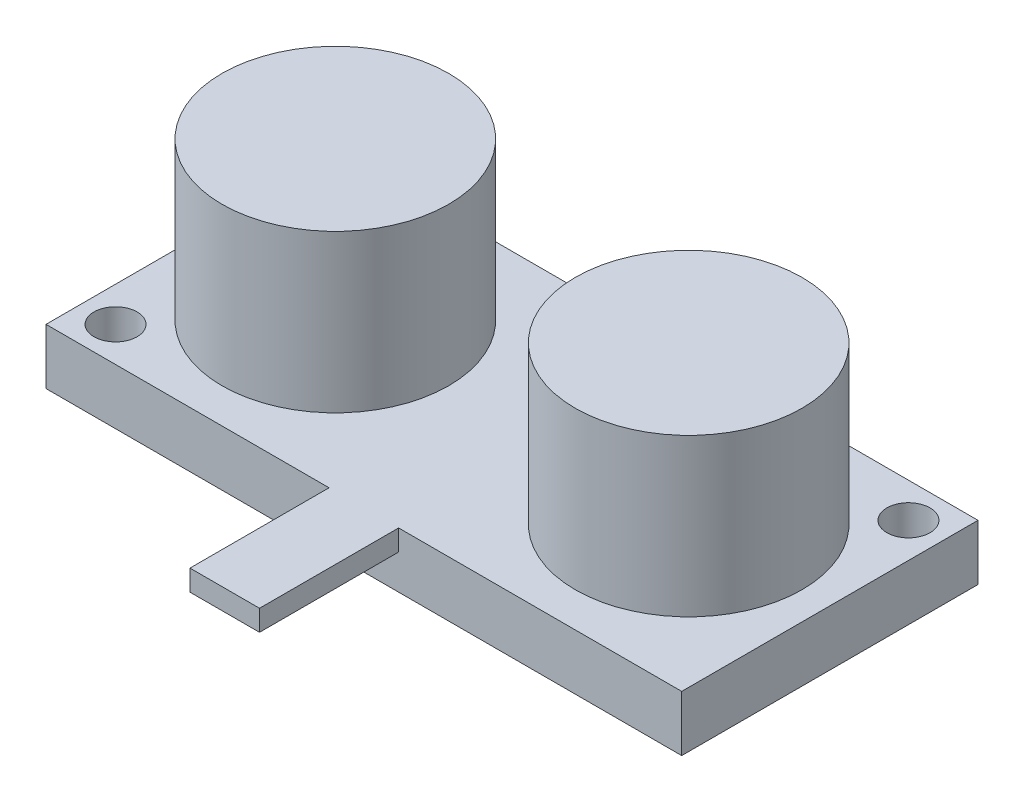
ISO-10303-21;
HEADER;
FILE_DESCRIPTION(('STEP AP214'),'2;1');
FILE_NAME('part.step','',(''),(''),'','','');
FILE_SCHEMA(('AUTOMOTIVE_DESIGN { 1 0 10303 214 1 1 1 1 }'));
ENDSEC;
DATA;
#1=APPLICATION_CONTEXT('core data for automotive mechanical design processes');
#2=APPLICATION_PROTOCOL_DEFINITION('international standard','automotive_design',2000,#1);
#3=PRODUCT_CONTEXT('',#1,'mechanical');
#4=PRODUCT('Part','Part','',(#3));
#5=PRODUCT_RELATED_PRODUCT_CATEGORY('part','',(#4));
#6=PRODUCT_DEFINITION_FORMATION('','',#4);
#7=PRODUCT_DEFINITION_CONTEXT('part definition',#1,'design');
#8=PRODUCT_DEFINITION('design','',#6,#7);
#9=PRODUCT_DEFINITION_SHAPE('','',#8);
#10=(LENGTH_UNIT() NAMED_UNIT(*) SI_UNIT(.MILLI.,.METRE.));
#11=(NAMED_UNIT(*) PLANE_ANGLE_UNIT() SI_UNIT($,.RADIAN.));
#12=(NAMED_UNIT(*) SI_UNIT($,.STERADIAN.) SOLID_ANGLE_UNIT());
#13=UNCERTAINTY_MEASURE_WITH_UNIT(LENGTH_MEASURE(1.E-05),#10,'distance_accuracy_value','');
#14=(GEOMETRIC_REPRESENTATION_CONTEXT(3) GLOBAL_UNCERTAINTY_ASSIGNED_CONTEXT((#13)) GLOBAL_UNIT_ASSIGNED_CONTEXT((#10,
#11,#12)) REPRESENTATION_CONTEXT('',''));
#15=CARTESIAN_POINT('',(0.,0.,0.));
#16=DIRECTION('',(0.,0.,1.));
#17=DIRECTION('',(1.,0.,0.));
#18=AXIS2_PLACEMENT_3D('',#15,#16,#17);
#19=CARTESIAN_POINT('',(35.55,15.3,-10.65));
#20=DIRECTION('',(0.,1.,0.));
#21=DIRECTION('',(0.,0.,1.));
#22=AXIS2_PLACEMENT_3D('',#19,#20,#21);
#23=PLANE('',#22);
#24=CARTESIAN_POINT('',(35.55,15.3,-10.65));
#25=DIRECTION('',(0.,-1.,0.));
#26=DIRECTION('',(0.,0.,-1.));
#27=AXIS2_PLACEMENT_3D('',#24,#25,#26);
#28=CIRCLE('',#27,8.15);
#29=CARTESIAN_POINT('',(35.55,15.3,-18.8));
#30=VERTEX_POINT('',#29);
#31=EDGE_CURVE('E20',#30,#30,#28,.T.);
#32=ORIENTED_EDGE('',*,*,#31,.F.);
#33=EDGE_LOOP('',(#32));
#34=FACE_BOUND('',#33,.T.);
#35=ADVANCED_FACE('F17',(#34),#23,.T.);
#36=CARTESIAN_POINT('',(10.15,15.3,-10.65));
#37=DIRECTION('',(0.,1.,0.));
#38=DIRECTION('',(0.,0.,1.));
#39=AXIS2_PLACEMENT_3D('',#36,#37,#38);
#40=PLANE('',#39);
#41=CARTESIAN_POINT('',(10.15,15.3,-10.65));
#42=DIRECTION('',(0.,-1.,0.));
#43=DIRECTION('',(0.,0.,-1.));
#44=AXIS2_PLACEMENT_3D('',#41,#42,#43);
#45=CIRCLE('',#44,8.15);
#46=CARTESIAN_POINT('',(10.15,15.3,-18.8));
#47=VERTEX_POINT('',#46);
#48=EDGE_CURVE('E107',#47,#47,#45,.T.);
#49=ORIENTED_EDGE('',*,*,#48,.F.);
#50=EDGE_LOOP('',(#49));
#51=FACE_BOUND('',#50,.T.);
#52=ADVANCED_FACE('F318',(#51),#40,.T.);
#53=CARTESIAN_POINT('',(35.55,15.3,-10.65));
#54=DIRECTION('',(0.,-1.,0.));
#55=DIRECTION('',(0.,0.,-1.));
#56=AXIS2_PLACEMENT_3D('',#53,#54,#55);
#57=CYLINDRICAL_SURFACE('',#56,8.15);
#58=CARTESIAN_POINT('',(35.55,4.,-10.65));
#59=DIRECTION('',(0.,-1.,0.));
#60=DIRECTION('',(0.,0.,-1.));
#61=AXIS2_PLACEMENT_3D('',#58,#59,#60);
#62=CIRCLE('',#61,8.15);
#63=CARTESIAN_POINT('',(35.55,4.,-18.8));
#64=VERTEX_POINT('',#63);
#65=EDGE_CURVE('E132',#64,#64,#62,.T.);
#66=ORIENTED_EDGE('',*,*,#65,.F.);
#67=EDGE_LOOP('',(#66));
#68=FACE_BOUND('',#67,.T.);
#69=ORIENTED_EDGE('',*,*,#31,.T.);
#70=EDGE_LOOP('',(#69));
#71=FACE_BOUND('',#70,.T.);
#72=ADVANCED_FACE('F310',(#68,#71),#57,.T.);
#73=CARTESIAN_POINT('',(20.35,2.5,10.));
#74=DIRECTION('',(1.,0.,0.));
#75=DIRECTION('',(0.,0.,-1.));
#76=AXIS2_PLACEMENT_3D('',#73,#74,#75);
#77=PLANE('',#76);
#78=DIRECTION('',(0.,0.,1.));
#79=VECTOR('',#78,1.);
#80=CARTESIAN_POINT('',(20.35,2.5,10.));
#81=LINE('',#80,#79);
#82=CARTESIAN_POINT('',(20.35,2.5,0.));
#83=VERTEX_POINT('',#82);
#84=CARTESIAN_POINT('',(20.35,2.5,10.));
#85=VERTEX_POINT('',#84);
#86=EDGE_CURVE('E102',#83,#85,#81,.T.);
#87=ORIENTED_EDGE('',*,*,#86,.T.);
#88=DIRECTION('',(0.,1.,0.));
#89=VECTOR('',#88,1.);
#90=CARTESIAN_POINT('',(20.35,4.,10.));
#91=LINE('',#90,#89);
#92=CARTESIAN_POINT('',(20.35,4.,10.));
#93=VERTEX_POINT('',#92);
#94=EDGE_CURVE('E88',#85,#93,#91,.T.);
#95=ORIENTED_EDGE('',*,*,#94,.T.);
#96=DIRECTION('',(0.,0.,1.));
#97=VECTOR('',#96,1.);
#98=CARTESIAN_POINT('',(20.35,4.,0.));
#99=LINE('',#98,#97);
#100=CARTESIAN_POINT('',(20.35,4.,0.));
#101=VERTEX_POINT('',#100);
#102=EDGE_CURVE('E134',#101,#93,#99,.T.);
#103=ORIENTED_EDGE('',*,*,#102,.F.);
#104=DIRECTION('',(0.,1.,0.));
#105=VECTOR('',#104,1.);
#106=CARTESIAN_POINT('',(20.35,2.5,0.));
#107=LINE('',#106,#105);
#108=EDGE_CURVE('E96',#83,#101,#107,.T.);
#109=ORIENTED_EDGE('',*,*,#108,.F.);
#110=EDGE_LOOP('',(#87,#95,#103,#109));
#111=FACE_BOUND('',#110,.T.);
#112=ADVANCED_FACE('F106',(#111),#77,.F.);
#113=CARTESIAN_POINT('',(20.35,4.,10.));
#114=DIRECTION('',(0.,0.,-1.));
#115=DIRECTION('',(-1.,0.,0.));
#116=AXIS2_PLACEMENT_3D('',#113,#114,#115);
#117=PLANE('',#116);
#118=DIRECTION('',(1.,0.,0.));
#119=VECTOR('',#118,1.);
#120=CARTESIAN_POINT('',(25.35,2.5,10.));
#121=LINE('',#120,#119);
#122=CARTESIAN_POINT('',(25.35,2.5,10.));
#123=VERTEX_POINT('',#122);
#124=EDGE_CURVE('E91',#85,#123,#121,.T.);
#125=ORIENTED_EDGE('',*,*,#124,.T.);
#126=DIRECTION('',(0.,1.,0.));
#127=VECTOR('',#126,1.);
#128=CARTESIAN_POINT('',(25.35,4.,10.));
#129=LINE('',#128,#127);
#130=CARTESIAN_POINT('',(25.35,4.,10.));
#131=VERTEX_POINT('',#130);
#132=EDGE_CURVE('E81',#123,#131,#129,.T.);
#133=ORIENTED_EDGE('',*,*,#132,.T.);
#134=DIRECTION('',(1.,0.,0.));
#135=VECTOR('',#134,1.);
#136=CARTESIAN_POINT('',(0.,4.,10.));
#137=LINE('',#136,#135);
#138=EDGE_CURVE('E92',#93,#131,#137,.T.);
#139=ORIENTED_EDGE('',*,*,#138,.F.);
#140=ORIENTED_EDGE('',*,*,#94,.F.);
#141=EDGE_LOOP('',(#125,#133,#139,#140));
#142=FACE_BOUND('',#141,.T.);
#143=ADVANCED_FACE('F90',(#142),#117,.F.);
#144=CARTESIAN_POINT('',(25.35,4.,10.));
#145=DIRECTION('',(-1.,0.,0.));
#146=DIRECTION('',(0.,0.,1.));
#147=AXIS2_PLACEMENT_3D('',#144,#145,#146);
#148=PLANE('',#147);
#149=DIRECTION('',(0.,0.,1.));
#150=VECTOR('',#149,1.);
#151=CARTESIAN_POINT('',(25.35,4.,0.));
#152=LINE('',#151,#150);
#153=CARTESIAN_POINT('',(25.35,4.,0.));
#154=VERTEX_POINT('',#153);
#155=EDGE_CURVE('E131',#131,#154,#152,.F.);
#156=ORIENTED_EDGE('',*,*,#155,.F.);
#157=ORIENTED_EDGE('',*,*,#132,.F.);
#158=DIRECTION('',(0.,0.,1.));
#159=VECTOR('',#158,1.);
#160=CARTESIAN_POINT('',(25.35,2.5,10.));
#161=LINE('',#160,#159);
#162=CARTESIAN_POINT('',(25.35,2.5,0.));
#163=VERTEX_POINT('',#162);
#164=EDGE_CURVE('E104',#123,#163,#161,.F.);
#165=ORIENTED_EDGE('',*,*,#164,.T.);
#166=DIRECTION('',(0.,1.,0.));
#167=VECTOR('',#166,1.);
#168=CARTESIAN_POINT('',(25.35,4.,0.));
#169=LINE('',#168,#167);
#170=EDGE_CURVE('E110',#154,#163,#169,.F.);
#171=ORIENTED_EDGE('',*,*,#170,.F.);
#172=EDGE_LOOP('',(#156,#157,#165,#171));
#173=FACE_BOUND('',#172,.T.);
#174=ADVANCED_FACE('F191',(#173),#148,.F.);
#175=CARTESIAN_POINT('',(10.15,15.3,-10.65));
#176=DIRECTION('',(0.,-1.,0.));
#177=DIRECTION('',(0.,0.,-1.));
#178=AXIS2_PLACEMENT_3D('',#175,#176,#177);
#179=CYLINDRICAL_SURFACE('',#178,8.15);
#180=CARTESIAN_POINT('',(10.15,4.,-10.65));
#181=DIRECTION('',(0.,-1.,0.));
#182=DIRECTION('',(0.,0.,-1.));
#183=AXIS2_PLACEMENT_3D('',#180,#181,#182);
#184=CIRCLE('',#183,8.15);
#185=CARTESIAN_POINT('',(10.15,4.,-18.8));
#186=VERTEX_POINT('',#185);
#187=EDGE_CURVE('E128',#186,#186,#184,.T.);
#188=ORIENTED_EDGE('',*,*,#187,.F.);
#189=EDGE_LOOP('',(#188));
#190=FACE_BOUND('',#189,.T.);
#191=ORIENTED_EDGE('',*,*,#48,.T.);
#192=EDGE_LOOP('',(#191));
#193=FACE_BOUND('',#192,.T.);
#194=ADVANCED_FACE('F193',(#190,#193),#179,.T.);
#195=CARTESIAN_POINT('',(25.35,2.5,10.));
#196=DIRECTION('',(0.,1.,0.));
#197=DIRECTION('',(0.,0.,1.));
#198=AXIS2_PLACEMENT_3D('',#195,#196,#197);
#199=PLANE('',#198);
#200=ORIENTED_EDGE('',*,*,#164,.F.);
#201=ORIENTED_EDGE('',*,*,#124,.F.);
#202=ORIENTED_EDGE('',*,*,#86,.F.);
#203=DIRECTION('',(-1.,0.,0.));
#204=VECTOR('',#203,1.);
#205=CARTESIAN_POINT('',(0.,2.5,0.));
#206=LINE('',#205,#204);
#207=EDGE_CURVE('E127',#83,#163,#206,.F.);
#208=ORIENTED_EDGE('',*,*,#207,.T.);
#209=EDGE_LOOP('',(#200,#201,#202,#208));
#210=FACE_BOUND('',#209,.T.);
#211=ADVANCED_FACE('F100',(#210),#199,.F.);
#212=CARTESIAN_POINT('',(0.,4.,0.));
#213=DIRECTION('',(0.,1.,0.));
#214=DIRECTION('',(0.,0.,1.));
#215=AXIS2_PLACEMENT_3D('',#212,#213,#214);
#216=PLANE('',#215);
#217=ORIENTED_EDGE('',*,*,#187,.T.);
#218=EDGE_LOOP('',(#217));
#219=FACE_BOUND('',#218,.T.);
#220=CARTESIAN_POINT('',(2.5,4.,-2.5));
#221=DIRECTION('',(0.,-1.,0.));
#222=DIRECTION('',(0.,0.,-1.));
#223=AXIS2_PLACEMENT_3D('',#220,#221,#222);
#224=CIRCLE('',#223,1.55);
#225=CARTESIAN_POINT('',(2.5,4.,-4.05));
#226=VERTEX_POINT('',#225);
#227=EDGE_CURVE('E120',#226,#226,#224,.T.);
#228=ORIENTED_EDGE('',*,*,#227,.T.);
#229=EDGE_LOOP('',(#228));
#230=FACE_BOUND('',#229,.T.);
#231=DIRECTION('',(0.,0.,1.));
#232=VECTOR('',#231,1.);
#233=CARTESIAN_POINT('',(45.7,4.,0.));
#234=LINE('',#233,#232);
#235=CARTESIAN_POINT('',(45.7,4.,0.));
#236=VERTEX_POINT('',#235);
#237=CARTESIAN_POINT('',(45.7,4.,-21.3));
#238=VERTEX_POINT('',#237);
#239=EDGE_CURVE('E151',#236,#238,#234,.F.);
#240=ORIENTED_EDGE('',*,*,#239,.T.);
#241=DIRECTION('',(1.,0.,0.));
#242=VECTOR('',#241,1.);
#243=CARTESIAN_POINT('',(45.7,4.,-21.3));
#244=LINE('',#243,#242);
#245=CARTESIAN_POINT('',(0.,4.,-21.3));
#246=VERTEX_POINT('',#245);
#247=EDGE_CURVE('E156',#238,#246,#244,.F.);
#248=ORIENTED_EDGE('',*,*,#247,.T.);
#249=DIRECTION('',(0.,0.,-1.));
#250=VECTOR('',#249,1.);
#251=CARTESIAN_POINT('',(0.,4.,-21.3));
#252=LINE('',#251,#250);
#253=CARTESIAN_POINT('',(0.,4.,0.));
#254=VERTEX_POINT('',#253);
#255=EDGE_CURVE('E159',#246,#254,#252,.F.);
#256=ORIENTED_EDGE('',*,*,#255,.T.);
#257=DIRECTION('',(-1.,0.,0.));
#258=VECTOR('',#257,1.);
#259=CARTESIAN_POINT('',(0.,4.,0.));
#260=LINE('',#259,#258);
#261=EDGE_CURVE('E145',#254,#101,#260,.F.);
#262=ORIENTED_EDGE('',*,*,#261,.T.);
#263=ORIENTED_EDGE('',*,*,#102,.T.);
#264=ORIENTED_EDGE('',*,*,#138,.T.);
#265=ORIENTED_EDGE('',*,*,#155,.T.);
#266=DIRECTION('',(-1.,0.,0.));
#267=VECTOR('',#266,1.);
#268=CARTESIAN_POINT('',(0.,4.,0.));
#269=LINE('',#268,#267);
#270=EDGE_CURVE('E143',#154,#236,#269,.F.);
#271=ORIENTED_EDGE('',*,*,#270,.T.);
#272=EDGE_LOOP('',(#240,#248,#256,#262,#263,#264,#265,#271));
#273=FACE_BOUND('',#272,.T.);
#274=CARTESIAN_POINT('',(43.2,4.,-18.8));
#275=DIRECTION('',(0.,-1.,0.));
#276=DIRECTION('',(0.,0.,-1.));
#277=AXIS2_PLACEMENT_3D('',#274,#275,#276);
#278=CIRCLE('',#277,1.55);
#279=CARTESIAN_POINT('',(43.2,4.,-20.35));
#280=VERTEX_POINT('',#279);
#281=EDGE_CURVE('E124',#280,#280,#278,.T.);
#282=ORIENTED_EDGE('',*,*,#281,.T.);
#283=EDGE_LOOP('',(#282));
#284=FACE_BOUND('',#283,.T.);
#285=ORIENTED_EDGE('',*,*,#65,.T.);
#286=EDGE_LOOP('',(#285));
#287=FACE_BOUND('',#286,.T.);
#288=ADVANCED_FACE('F189',(#219,#230,#273,#284,#287),#216,.T.);
#289=CARTESIAN_POINT('',(43.2,4.,-18.8));
#290=DIRECTION('',(0.,-1.,0.));
#291=DIRECTION('',(0.,0.,-1.));
#292=AXIS2_PLACEMENT_3D('',#289,#290,#291);
#293=CYLINDRICAL_SURFACE('',#292,1.55);
#294=CARTESIAN_POINT('',(43.2,0.,-18.8));
#295=DIRECTION('',(0.,-1.,0.));
#296=DIRECTION('',(0.,0.,-1.));
#297=AXIS2_PLACEMENT_3D('',#294,#295,#296);
#298=CIRCLE('',#297,1.55);
#299=CARTESIAN_POINT('',(43.2,0.,-20.35));
#300=VERTEX_POINT('',#299);
#301=EDGE_CURVE('E116',#300,#300,#298,.T.);
#302=ORIENTED_EDGE('',*,*,#301,.T.);
#303=EDGE_LOOP('',(#302));
#304=FACE_BOUND('',#303,.T.);
#305=ORIENTED_EDGE('',*,*,#281,.F.);
#306=EDGE_LOOP('',(#305));
#307=FACE_BOUND('',#306,.T.);
#308=ADVANCED_FACE('F222',(#304,#307),#293,.F.);
#309=CARTESIAN_POINT('',(0.,4.,0.));
#310=DIRECTION('',(0.,0.,-1.));
#311=DIRECTION('',(-1.,0.,0.));
#312=AXIS2_PLACEMENT_3D('',#309,#310,#311);
#313=PLANE('',#312);
#314=ORIENTED_EDGE('',*,*,#261,.F.);
#315=DIRECTION('',(0.,1.,0.));
#316=VECTOR('',#315,1.);
#317=CARTESIAN_POINT('',(0.,4.,0.));
#318=LINE('',#317,#316);
#319=CARTESIAN_POINT('',(0.,0.,0.));
#320=VERTEX_POINT('',#319);
#321=EDGE_CURVE('E123',#254,#320,#318,.F.);
#322=ORIENTED_EDGE('',*,*,#321,.T.);
#323=DIRECTION('',(1.,0.,0.));
#324=VECTOR('',#323,1.);
#325=CARTESIAN_POINT('',(0.,0.,0.));
#326=LINE('',#325,#324);
#327=CARTESIAN_POINT('',(45.7,0.,0.));
#328=VERTEX_POINT('',#327);
#329=EDGE_CURVE('E119',#320,#328,#326,.T.);
#330=ORIENTED_EDGE('',*,*,#329,.T.);
#331=DIRECTION('',(0.,1.,0.));
#332=VECTOR('',#331,1.);
#333=CARTESIAN_POINT('',(45.7,4.,0.));
#334=LINE('',#333,#332);
#335=EDGE_CURVE('E148',#328,#236,#334,.T.);
#336=ORIENTED_EDGE('',*,*,#335,.T.);
#337=ORIENTED_EDGE('',*,*,#270,.F.);
#338=ORIENTED_EDGE('',*,*,#170,.T.);
#339=ORIENTED_EDGE('',*,*,#207,.F.);
#340=ORIENTED_EDGE('',*,*,#108,.T.);
#341=EDGE_LOOP('',(#314,#322,#330,#336,#337,#338,#339,#340));
#342=FACE_BOUND('',#341,.T.);
#343=ADVANCED_FACE('F186',(#342),#313,.F.);
#344=CARTESIAN_POINT('',(45.7,4.,0.));
#345=DIRECTION('',(-1.,0.,0.));
#346=DIRECTION('',(0.,0.,1.));
#347=AXIS2_PLACEMENT_3D('',#344,#345,#346);
#348=PLANE('',#347);
#349=DIRECTION('',(0.,1.,0.));
#350=VECTOR('',#349,1.);
#351=CARTESIAN_POINT('',(45.7,4.,-21.3));
#352=LINE('',#351,#350);
#353=CARTESIAN_POINT('',(45.7,0.,-21.3));
#354=VERTEX_POINT('',#353);
#355=EDGE_CURVE('E153',#354,#238,#352,.T.);
#356=ORIENTED_EDGE('',*,*,#355,.T.);
#357=ORIENTED_EDGE('',*,*,#239,.F.);
#358=ORIENTED_EDGE('',*,*,#335,.F.);
#359=DIRECTION('',(0.,0.,1.));
#360=VECTOR('',#359,1.);
#361=CARTESIAN_POINT('',(45.7,0.,0.));
#362=LINE('',#361,#360);
#363=EDGE_CURVE('E166',#328,#354,#362,.F.);
#364=ORIENTED_EDGE('',*,*,#363,.T.);
#365=EDGE_LOOP('',(#356,#357,#358,#364));
#366=FACE_BOUND('',#365,.T.);
#367=ADVANCED_FACE('F184',(#366),#348,.F.);
#368=CARTESIAN_POINT('',(45.7,4.,-21.3));
#369=DIRECTION('',(0.,0.,1.));
#370=DIRECTION('',(1.,0.,0.));
#371=AXIS2_PLACEMENT_3D('',#368,#369,#370);
#372=PLANE('',#371);
#373=DIRECTION('',(0.,1.,0.));
#374=VECTOR('',#373,1.);
#375=CARTESIAN_POINT('',(0.,4.,-21.3));
#376=LINE('',#375,#374);
#377=CARTESIAN_POINT('',(0.,0.,-21.3));
#378=VERTEX_POINT('',#377);
#379=EDGE_CURVE('E35',#378,#246,#376,.T.);
#380=ORIENTED_EDGE('',*,*,#379,.T.);
#381=ORIENTED_EDGE('',*,*,#247,.F.);
#382=ORIENTED_EDGE('',*,*,#355,.F.);
#383=DIRECTION('',(1.,0.,0.));
#384=VECTOR('',#383,1.);
#385=CARTESIAN_POINT('',(0.,0.,-21.3));
#386=LINE('',#385,#384);
#387=EDGE_CURVE('E169',#354,#378,#386,.F.);
#388=ORIENTED_EDGE('',*,*,#387,.T.);
#389=EDGE_LOOP('',(#380,#381,#382,#388));
#390=FACE_BOUND('',#389,.T.);
#391=ADVANCED_FACE('F180',(#390),#372,.F.);
#392=CARTESIAN_POINT('',(0.,4.,-21.3));
#393=DIRECTION('',(1.,0.,0.));
#394=DIRECTION('',(0.,0.,-1.));
#395=AXIS2_PLACEMENT_3D('',#392,#393,#394);
#396=PLANE('',#395);
#397=ORIENTED_EDGE('',*,*,#321,.F.);
#398=ORIENTED_EDGE('',*,*,#255,.F.);
#399=ORIENTED_EDGE('',*,*,#379,.F.);
#400=DIRECTION('',(0.,0.,1.));
#401=VECTOR('',#400,1.);
#402=CARTESIAN_POINT('',(0.,0.,0.));
#403=LINE('',#402,#401);
#404=EDGE_CURVE('E26',#378,#320,#403,.T.);
#405=ORIENTED_EDGE('',*,*,#404,.T.);
#406=EDGE_LOOP('',(#397,#398,#399,#405));
#407=FACE_BOUND('',#406,.T.);
#408=ADVANCED_FACE('F173',(#407),#396,.F.);
#409=CARTESIAN_POINT('',(2.5,4.,-2.5));
#410=DIRECTION('',(0.,-1.,0.));
#411=DIRECTION('',(0.,0.,-1.));
#412=AXIS2_PLACEMENT_3D('',#409,#410,#411);
#413=CYLINDRICAL_SURFACE('',#412,1.55);
#414=CARTESIAN_POINT('',(2.5,0.,-2.5));
#415=DIRECTION('',(0.,-1.,0.));
#416=DIRECTION('',(0.,0.,-1.));
#417=AXIS2_PLACEMENT_3D('',#414,#415,#416);
#418=CIRCLE('',#417,1.55);
#419=CARTESIAN_POINT('',(2.5,0.,-4.05));
#420=VERTEX_POINT('',#419);
#421=EDGE_CURVE('E11',#420,#420,#418,.T.);
#422=ORIENTED_EDGE('',*,*,#421,.T.);
#423=EDGE_LOOP('',(#422));
#424=FACE_BOUND('',#423,.T.);
#425=ORIENTED_EDGE('',*,*,#227,.F.);
#426=EDGE_LOOP('',(#425));
#427=FACE_BOUND('',#426,.T.);
#428=ADVANCED_FACE('F204',(#424,#427),#413,.F.);
#429=CARTESIAN_POINT('',(0.,0.,0.));
#430=DIRECTION('',(0.,1.,0.));
#431=DIRECTION('',(0.,0.,1.));
#432=AXIS2_PLACEMENT_3D('',#429,#430,#431);
#433=PLANE('',#432);
#434=ORIENTED_EDGE('',*,*,#421,.F.);
#435=EDGE_LOOP('',(#434));
#436=FACE_BOUND('',#435,.T.);
#437=ORIENTED_EDGE('',*,*,#387,.F.);
#438=ORIENTED_EDGE('',*,*,#363,.F.);
#439=ORIENTED_EDGE('',*,*,#329,.F.);
#440=ORIENTED_EDGE('',*,*,#404,.F.);
#441=EDGE_LOOP('',(#437,#438,#439,#440));
#442=FACE_BOUND('',#441,.T.);
#443=ORIENTED_EDGE('',*,*,#301,.F.);
#444=EDGE_LOOP('',(#443));
#445=FACE_BOUND('',#444,.T.);
#446=ADVANCED_FACE('F176',(#436,#442,#445),#433,.F.);
#447=CLOSED_SHELL('',(#35,#52,#72,#112,#143,#174,#194,#211,#288,#308,#343,#367,#391,#408,#428,#446));
#448=MANIFOLD_SOLID_BREP('B1',#447);
#449=ADVANCED_BREP_SHAPE_REPRESENTATION('',(#18,#448),#14);
#450=SHAPE_DEFINITION_REPRESENTATION(#9,#449);
ENDSEC;
END-ISO-10303-21;
